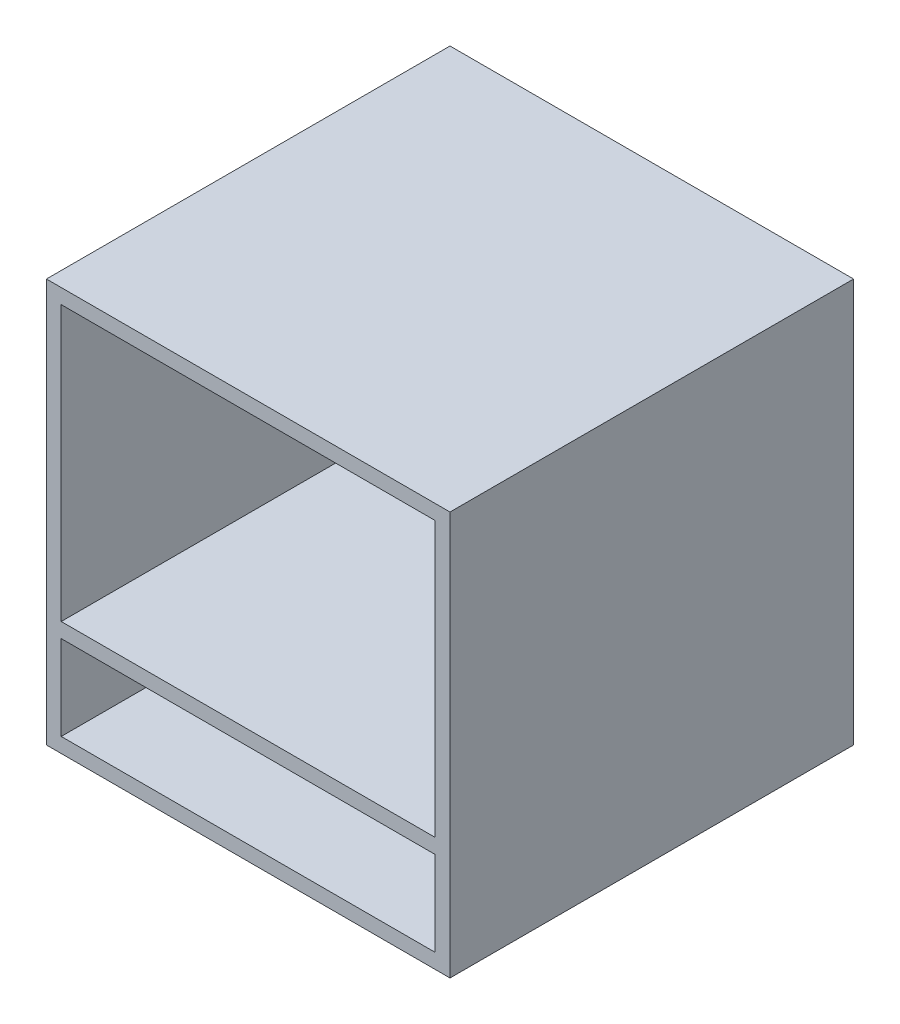
ISO-10303-21;
HEADER;
FILE_DESCRIPTION(('STEP AP214'),'2;1');
FILE_NAME('part.step','',(''),(''),'','','');
FILE_SCHEMA(('AUTOMOTIVE_DESIGN { 1 0 10303 214 1 1 1 1 }'));
ENDSEC;
DATA;
#1=APPLICATION_CONTEXT('core data for automotive mechanical design processes');
#2=APPLICATION_PROTOCOL_DEFINITION('international standard','automotive_design',2000,#1);
#3=PRODUCT_CONTEXT('',#1,'mechanical');
#4=PRODUCT('Part','Part','',(#3));
#5=PRODUCT_RELATED_PRODUCT_CATEGORY('part','',(#4));
#6=PRODUCT_DEFINITION_FORMATION('','',#4);
#7=PRODUCT_DEFINITION_CONTEXT('part definition',#1,'design');
#8=PRODUCT_DEFINITION('design','',#6,#7);
#9=PRODUCT_DEFINITION_SHAPE('','',#8);
#10=(LENGTH_UNIT() NAMED_UNIT(*) SI_UNIT(.MILLI.,.METRE.));
#11=(NAMED_UNIT(*) PLANE_ANGLE_UNIT() SI_UNIT($,.RADIAN.));
#12=(NAMED_UNIT(*) SI_UNIT($,.STERADIAN.) SOLID_ANGLE_UNIT());
#13=UNCERTAINTY_MEASURE_WITH_UNIT(LENGTH_MEASURE(1.E-05),#10,'distance_accuracy_value','');
#14=(GEOMETRIC_REPRESENTATION_CONTEXT(3) GLOBAL_UNCERTAINTY_ASSIGNED_CONTEXT((#13)) GLOBAL_UNIT_ASSIGNED_CONTEXT((#10,
#11,#12)) REPRESENTATION_CONTEXT('',''));
#15=CARTESIAN_POINT('',(0.,0.,0.));
#16=DIRECTION('',(0.,0.,1.));
#17=DIRECTION('',(1.,0.,0.));
#18=AXIS2_PLACEMENT_3D('',#15,#16,#17);
#19=CARTESIAN_POINT('',(139.,300.,-150.));
#20=DIRECTION('',(-1.,0.,0.));
#21=DIRECTION('',(0.,0.,1.));
#22=AXIS2_PLACEMENT_3D('',#19,#20,#21);
#23=PLANE('',#22);
#24=DIRECTION('',(0.,0.,1.));
#25=VECTOR('',#24,1.);
#26=CARTESIAN_POINT('',(139.,74.,-150.));
#27=LINE('',#26,#25);
#28=CARTESIAN_POINT('',(139.,74.,-139.));
#29=VERTEX_POINT('',#28);
#30=CARTESIAN_POINT('',(139.,74.,150.));
#31=VERTEX_POINT('',#30);
#32=EDGE_CURVE('E144',#29,#31,#27,.T.);
#33=ORIENTED_EDGE('',*,*,#32,.F.);
#34=DIRECTION('',(0.,-1.,0.));
#35=VECTOR('',#34,1.);
#36=CARTESIAN_POINT('',(139.,300.,-139.));
#37=LINE('',#36,#35);
#38=CARTESIAN_POINT('',(139.,11.,-139.));
#39=VERTEX_POINT('',#38);
#40=EDGE_CURVE('E164',#29,#39,#37,.T.);
#41=ORIENTED_EDGE('',*,*,#40,.T.);
#42=DIRECTION('',(0.,0.,-1.));
#43=VECTOR('',#42,1.);
#44=CARTESIAN_POINT('',(139.,11.,-150.));
#45=LINE('',#44,#43);
#46=CARTESIAN_POINT('',(139.,11.,150.));
#47=VERTEX_POINT('',#46);
#48=EDGE_CURVE('E157',#47,#39,#45,.T.);
#49=ORIENTED_EDGE('',*,*,#48,.F.);
#50=DIRECTION('',(0.,-1.,0.));
#51=VECTOR('',#50,1.);
#52=CARTESIAN_POINT('',(139.,300.,150.));
#53=LINE('',#52,#51);
#54=EDGE_CURVE('E49',#31,#47,#53,.T.);
#55=ORIENTED_EDGE('',*,*,#54,.F.);
#56=EDGE_LOOP('',(#33,#41,#49,#55));
#57=FACE_BOUND('',#56,.T.);
#58=ADVANCED_FACE('F34',(#57),#23,.T.);
#59=CARTESIAN_POINT('',(-150.,300.,-139.));
#60=DIRECTION('',(0.,0.,1.));
#61=DIRECTION('',(1.,0.,0.));
#62=AXIS2_PLACEMENT_3D('',#59,#60,#61);
#63=PLANE('',#62);
#64=DIRECTION('',(1.,0.,0.));
#65=VECTOR('',#64,1.);
#66=CARTESIAN_POINT('',(-150.,74.,-139.));
#67=LINE('',#66,#65);
#68=CARTESIAN_POINT('',(-139.,74.,-139.));
#69=VERTEX_POINT('',#68);
#70=EDGE_CURVE('E154',#69,#29,#67,.T.);
#71=ORIENTED_EDGE('',*,*,#70,.F.);
#72=DIRECTION('',(0.,-1.,0.));
#73=VECTOR('',#72,1.);
#74=CARTESIAN_POINT('',(-139.,300.,-139.));
#75=LINE('',#74,#73);
#76=CARTESIAN_POINT('',(-139.,11.,-139.));
#77=VERTEX_POINT('',#76);
#78=EDGE_CURVE('E140',#69,#77,#75,.T.);
#79=ORIENTED_EDGE('',*,*,#78,.T.);
#80=DIRECTION('',(-1.,0.,0.));
#81=VECTOR('',#80,1.);
#82=CARTESIAN_POINT('',(-150.,11.,-139.));
#83=LINE('',#82,#81);
#84=EDGE_CURVE('E160',#39,#77,#83,.T.);
#85=ORIENTED_EDGE('',*,*,#84,.F.);
#86=ORIENTED_EDGE('',*,*,#40,.F.);
#87=EDGE_LOOP('',(#71,#79,#85,#86));
#88=FACE_BOUND('',#87,.T.);
#89=ADVANCED_FACE('F238',(#88),#63,.T.);
#90=CARTESIAN_POINT('',(-139.,300.,-150.));
#91=DIRECTION('',(1.,0.,0.));
#92=DIRECTION('',(0.,0.,-1.));
#93=AXIS2_PLACEMENT_3D('',#90,#91,#92);
#94=PLANE('',#93);
#95=DIRECTION('',(0.,0.,-1.));
#96=VECTOR('',#95,1.);
#97=CARTESIAN_POINT('',(-139.,74.,-150.));
#98=LINE('',#97,#96);
#99=CARTESIAN_POINT('',(-139.,74.,150.));
#100=VERTEX_POINT('',#99);
#101=EDGE_CURVE('E11',#100,#69,#98,.T.);
#102=ORIENTED_EDGE('',*,*,#101,.F.);
#103=DIRECTION('',(0.,-1.,0.));
#104=VECTOR('',#103,1.);
#105=CARTESIAN_POINT('',(-139.,300.,150.));
#106=LINE('',#105,#104);
#107=CARTESIAN_POINT('',(-139.,11.,150.));
#108=VERTEX_POINT('',#107);
#109=EDGE_CURVE('E124',#100,#108,#106,.T.);
#110=ORIENTED_EDGE('',*,*,#109,.T.);
#111=DIRECTION('',(0.,0.,1.));
#112=VECTOR('',#111,1.);
#113=CARTESIAN_POINT('',(-139.,11.,-150.));
#114=LINE('',#113,#112);
#115=EDGE_CURVE('E171',#77,#108,#114,.T.);
#116=ORIENTED_EDGE('',*,*,#115,.F.);
#117=ORIENTED_EDGE('',*,*,#78,.F.);
#118=EDGE_LOOP('',(#102,#110,#116,#117));
#119=FACE_BOUND('',#118,.T.);
#120=ADVANCED_FACE('F139',(#119),#94,.T.);
#121=CARTESIAN_POINT('',(-150.,300.,150.));
#122=DIRECTION('',(0.,0.,-1.));
#123=DIRECTION('',(-1.,0.,0.));
#124=AXIS2_PLACEMENT_3D('',#121,#122,#123);
#125=PLANE('',#124);
#126=DIRECTION('',(1.,0.,0.));
#127=VECTOR('',#126,1.);
#128=CARTESIAN_POINT('',(-150.,74.,150.));
#129=LINE('',#128,#127);
#130=EDGE_CURVE('E129',#100,#31,#129,.T.);
#131=ORIENTED_EDGE('',*,*,#130,.T.);
#132=ORIENTED_EDGE('',*,*,#54,.T.);
#133=DIRECTION('',(1.,0.,0.));
#134=VECTOR('',#133,1.);
#135=CARTESIAN_POINT('',(-150.,11.,150.));
#136=LINE('',#135,#134);
#137=EDGE_CURVE('E131',#108,#47,#136,.T.);
#138=ORIENTED_EDGE('',*,*,#137,.F.);
#139=ORIENTED_EDGE('',*,*,#109,.F.);
#140=EDGE_LOOP('',(#131,#132,#138,#139));
#141=FACE_BOUND('',#140,.T.);
#142=DIRECTION('',(-1.,0.,0.));
#143=VECTOR('',#142,1.);
#144=CARTESIAN_POINT('',(-150.,85.,150.));
#145=LINE('',#144,#143);
#146=CARTESIAN_POINT('',(139.,85.,150.));
#147=VERTEX_POINT('',#146);
#148=CARTESIAN_POINT('',(-139.,85.,150.));
#149=VERTEX_POINT('',#148);
#150=EDGE_CURVE('E146',#147,#149,#145,.T.);
#151=ORIENTED_EDGE('',*,*,#150,.T.);
#152=CARTESIAN_POINT('',(-139.,289.,150.));
#153=VERTEX_POINT('',#152);
#154=EDGE_CURVE('E135',#153,#149,#106,.T.);
#155=ORIENTED_EDGE('',*,*,#154,.F.);
#156=DIRECTION('',(1.,0.,0.));
#157=VECTOR('',#156,1.);
#158=CARTESIAN_POINT('',(-150.,289.,150.));
#159=LINE('',#158,#157);
#160=CARTESIAN_POINT('',(139.,289.,150.));
#161=VERTEX_POINT('',#160);
#162=EDGE_CURVE('E180',#153,#161,#159,.T.);
#163=ORIENTED_EDGE('',*,*,#162,.T.);
#164=EDGE_CURVE('E136',#161,#147,#53,.T.);
#165=ORIENTED_EDGE('',*,*,#164,.T.);
#166=EDGE_LOOP('',(#151,#155,#163,#165));
#167=FACE_BOUND('',#166,.T.);
#168=DIRECTION('',(0.,-1.,0.));
#169=VECTOR('',#168,1.);
#170=CARTESIAN_POINT('',(-150.,300.,150.));
#171=LINE('',#170,#169);
#172=CARTESIAN_POINT('',(-150.,300.,150.));
#173=VERTEX_POINT('',#172);
#174=CARTESIAN_POINT('',(-150.,0.,150.));
#175=VERTEX_POINT('',#174);
#176=EDGE_CURVE('E207',#173,#175,#171,.T.);
#177=ORIENTED_EDGE('',*,*,#176,.T.);
#178=DIRECTION('',(1.,0.,0.));
#179=VECTOR('',#178,1.);
#180=CARTESIAN_POINT('',(-150.,0.,150.));
#181=LINE('',#180,#179);
#182=CARTESIAN_POINT('',(150.,0.,150.));
#183=VERTEX_POINT('',#182);
#184=EDGE_CURVE('E189',#175,#183,#181,.T.);
#185=ORIENTED_EDGE('',*,*,#184,.T.);
#186=DIRECTION('',(0.,-1.,0.));
#187=VECTOR('',#186,1.);
#188=CARTESIAN_POINT('',(150.,300.,150.));
#189=LINE('',#188,#187);
#190=CARTESIAN_POINT('',(150.,300.,150.));
#191=VERTEX_POINT('',#190);
#192=EDGE_CURVE('E195',#191,#183,#189,.T.);
#193=ORIENTED_EDGE('',*,*,#192,.F.);
#194=DIRECTION('',(1.,0.,0.));
#195=VECTOR('',#194,1.);
#196=CARTESIAN_POINT('',(-150.,300.,150.));
#197=LINE('',#196,#195);
#198=EDGE_CURVE('E193',#173,#191,#197,.T.);
#199=ORIENTED_EDGE('',*,*,#198,.F.);
#200=EDGE_LOOP('',(#177,#185,#193,#199));
#201=FACE_BOUND('',#200,.T.);
#202=ADVANCED_FACE('F126',(#141,#167,#201),#125,.F.);
#203=CARTESIAN_POINT('',(150.,300.,-150.));
#204=DIRECTION('',(-1.,0.,0.));
#205=DIRECTION('',(0.,0.,1.));
#206=AXIS2_PLACEMENT_3D('',#203,#204,#205);
#207=PLANE('',#206);
#208=ORIENTED_EDGE('',*,*,#192,.T.);
#209=DIRECTION('',(0.,0.,-1.));
#210=VECTOR('',#209,1.);
#211=CARTESIAN_POINT('',(150.,0.,-150.));
#212=LINE('',#211,#210);
#213=CARTESIAN_POINT('',(150.,0.,-150.));
#214=VERTEX_POINT('',#213);
#215=EDGE_CURVE('E163',#183,#214,#212,.T.);
#216=ORIENTED_EDGE('',*,*,#215,.T.);
#217=DIRECTION('',(0.,-1.,0.));
#218=VECTOR('',#217,1.);
#219=CARTESIAN_POINT('',(150.,300.,-150.));
#220=LINE('',#219,#218);
#221=CARTESIAN_POINT('',(150.,300.,-150.));
#222=VERTEX_POINT('',#221);
#223=EDGE_CURVE('E211',#222,#214,#220,.T.);
#224=ORIENTED_EDGE('',*,*,#223,.F.);
#225=DIRECTION('',(0.,0.,-1.));
#226=VECTOR('',#225,1.);
#227=CARTESIAN_POINT('',(150.,300.,-150.));
#228=LINE('',#227,#226);
#229=EDGE_CURVE('E185',#191,#222,#228,.T.);
#230=ORIENTED_EDGE('',*,*,#229,.F.);
#231=EDGE_LOOP('',(#208,#216,#224,#230));
#232=FACE_BOUND('',#231,.T.);
#233=ADVANCED_FACE('F36',(#232),#207,.F.);
#234=CARTESIAN_POINT('',(-150.,300.,-150.));
#235=DIRECTION('',(0.,0.,1.));
#236=DIRECTION('',(1.,0.,0.));
#237=AXIS2_PLACEMENT_3D('',#234,#235,#236);
#238=PLANE('',#237);
#239=ORIENTED_EDGE('',*,*,#223,.T.);
#240=DIRECTION('',(-1.,0.,0.));
#241=VECTOR('',#240,1.);
#242=CARTESIAN_POINT('',(-150.,0.,-150.));
#243=LINE('',#242,#241);
#244=CARTESIAN_POINT('',(-150.,0.,-150.));
#245=VERTEX_POINT('',#244);
#246=EDGE_CURVE('E198',#214,#245,#243,.T.);
#247=ORIENTED_EDGE('',*,*,#246,.T.);
#248=DIRECTION('',(0.,-1.,0.));
#249=VECTOR('',#248,1.);
#250=CARTESIAN_POINT('',(-150.,300.,-150.));
#251=LINE('',#250,#249);
#252=CARTESIAN_POINT('',(-150.,300.,-150.));
#253=VERTEX_POINT('',#252);
#254=EDGE_CURVE('E209',#253,#245,#251,.T.);
#255=ORIENTED_EDGE('',*,*,#254,.F.);
#256=DIRECTION('',(-1.,0.,0.));
#257=VECTOR('',#256,1.);
#258=CARTESIAN_POINT('',(-150.,300.,-150.));
#259=LINE('',#258,#257);
#260=EDGE_CURVE('E188',#222,#253,#259,.T.);
#261=ORIENTED_EDGE('',*,*,#260,.F.);
#262=EDGE_LOOP('',(#239,#247,#255,#261));
#263=FACE_BOUND('',#262,.T.);
#264=ADVANCED_FACE('F267',(#263),#238,.F.);
#265=CARTESIAN_POINT('',(-150.,300.,-150.));
#266=DIRECTION('',(1.,0.,0.));
#267=DIRECTION('',(0.,0.,-1.));
#268=AXIS2_PLACEMENT_3D('',#265,#266,#267);
#269=PLANE('',#268);
#270=ORIENTED_EDGE('',*,*,#254,.T.);
#271=DIRECTION('',(0.,0.,1.));
#272=VECTOR('',#271,1.);
#273=CARTESIAN_POINT('',(-150.,0.,-150.));
#274=LINE('',#273,#272);
#275=EDGE_CURVE('E201',#245,#175,#274,.T.);
#276=ORIENTED_EDGE('',*,*,#275,.T.);
#277=ORIENTED_EDGE('',*,*,#176,.F.);
#278=DIRECTION('',(0.,0.,1.));
#279=VECTOR('',#278,1.);
#280=CARTESIAN_POINT('',(-150.,300.,-150.));
#281=LINE('',#280,#279);
#282=EDGE_CURVE('E191',#253,#173,#281,.T.);
#283=ORIENTED_EDGE('',*,*,#282,.F.);
#284=EDGE_LOOP('',(#270,#276,#277,#283));
#285=FACE_BOUND('',#284,.T.);
#286=ADVANCED_FACE('F258',(#285),#269,.F.);
#287=CARTESIAN_POINT('',(0.,300.,0.));
#288=DIRECTION('',(0.,1.,0.));
#289=DIRECTION('',(0.,0.,1.));
#290=AXIS2_PLACEMENT_3D('',#287,#288,#289);
#291=PLANE('',#290);
#292=ORIENTED_EDGE('',*,*,#229,.T.);
#293=ORIENTED_EDGE('',*,*,#260,.T.);
#294=ORIENTED_EDGE('',*,*,#282,.T.);
#295=ORIENTED_EDGE('',*,*,#198,.T.);
#296=EDGE_LOOP('',(#292,#293,#294,#295));
#297=FACE_BOUND('',#296,.T.);
#298=ADVANCED_FACE('F252',(#297),#291,.T.);
#299=CARTESIAN_POINT('',(0.,0.,0.));
#300=DIRECTION('',(0.,1.,0.));
#301=DIRECTION('',(0.,0.,1.));
#302=AXIS2_PLACEMENT_3D('',#299,#300,#301);
#303=PLANE('',#302);
#304=ORIENTED_EDGE('',*,*,#215,.F.);
#305=ORIENTED_EDGE('',*,*,#184,.F.);
#306=ORIENTED_EDGE('',*,*,#275,.F.);
#307=ORIENTED_EDGE('',*,*,#246,.F.);
#308=EDGE_LOOP('',(#304,#305,#306,#307));
#309=FACE_BOUND('',#308,.T.);
#310=ADVANCED_FACE('F248',(#309),#303,.F.);
#311=DIRECTION('',(0.,0.,-1.));
#312=VECTOR('',#311,1.);
#313=CARTESIAN_POINT('',(139.,85.,-150.));
#314=LINE('',#313,#312);
#315=CARTESIAN_POINT('',(139.,85.,-139.));
#316=VERTEX_POINT('',#315);
#317=EDGE_CURVE('E57',#147,#316,#314,.T.);
#318=ORIENTED_EDGE('',*,*,#317,.F.);
#319=ORIENTED_EDGE('',*,*,#164,.F.);
#320=DIRECTION('',(0.,0.,-1.));
#321=VECTOR('',#320,1.);
#322=CARTESIAN_POINT('',(139.,289.,-150.));
#323=LINE('',#322,#321);
#324=CARTESIAN_POINT('',(139.,289.,-139.));
#325=VERTEX_POINT('',#324);
#326=EDGE_CURVE('E165',#161,#325,#323,.T.);
#327=ORIENTED_EDGE('',*,*,#326,.T.);
#328=EDGE_CURVE('E161',#325,#316,#37,.T.);
#329=ORIENTED_EDGE('',*,*,#328,.T.);
#330=EDGE_LOOP('',(#318,#319,#327,#329));
#331=FACE_BOUND('',#330,.T.);
#332=ADVANCED_FACE('F221',(#331),#23,.T.);
#333=DIRECTION('',(-1.,0.,0.));
#334=VECTOR('',#333,1.);
#335=CARTESIAN_POINT('',(-150.,85.,-139.));
#336=LINE('',#335,#334);
#337=CARTESIAN_POINT('',(-139.,85.,-139.));
#338=VERTEX_POINT('',#337);
#339=EDGE_CURVE('E145',#316,#338,#336,.T.);
#340=ORIENTED_EDGE('',*,*,#339,.F.);
#341=ORIENTED_EDGE('',*,*,#328,.F.);
#342=DIRECTION('',(-1.,0.,0.));
#343=VECTOR('',#342,1.);
#344=CARTESIAN_POINT('',(-150.,289.,-139.));
#345=LINE('',#344,#343);
#346=CARTESIAN_POINT('',(-139.,289.,-139.));
#347=VERTEX_POINT('',#346);
#348=EDGE_CURVE('E168',#325,#347,#345,.T.);
#349=ORIENTED_EDGE('',*,*,#348,.T.);
#350=EDGE_CURVE('E172',#347,#338,#75,.T.);
#351=ORIENTED_EDGE('',*,*,#350,.T.);
#352=EDGE_LOOP('',(#340,#341,#349,#351));
#353=FACE_BOUND('',#352,.T.);
#354=ADVANCED_FACE('F227',(#353),#63,.T.);
#355=DIRECTION('',(0.,0.,1.));
#356=VECTOR('',#355,1.);
#357=CARTESIAN_POINT('',(-139.,85.,-150.));
#358=LINE('',#357,#356);
#359=EDGE_CURVE('E42',#338,#149,#358,.T.);
#360=ORIENTED_EDGE('',*,*,#359,.F.);
#361=ORIENTED_EDGE('',*,*,#350,.F.);
#362=DIRECTION('',(0.,0.,1.));
#363=VECTOR('',#362,1.);
#364=CARTESIAN_POINT('',(-139.,289.,-150.));
#365=LINE('',#364,#363);
#366=EDGE_CURVE('E176',#347,#153,#365,.T.);
#367=ORIENTED_EDGE('',*,*,#366,.T.);
#368=ORIENTED_EDGE('',*,*,#154,.T.);
#369=EDGE_LOOP('',(#360,#361,#367,#368));
#370=FACE_BOUND('',#369,.T.);
#371=ADVANCED_FACE('F228',(#370),#94,.T.);
#372=CARTESIAN_POINT('',(0.,289.,0.));
#373=DIRECTION('',(0.,1.,0.));
#374=DIRECTION('',(0.,0.,1.));
#375=AXIS2_PLACEMENT_3D('',#372,#373,#374);
#376=PLANE('',#375);
#377=ORIENTED_EDGE('',*,*,#326,.F.);
#378=ORIENTED_EDGE('',*,*,#162,.F.);
#379=ORIENTED_EDGE('',*,*,#366,.F.);
#380=ORIENTED_EDGE('',*,*,#348,.F.);
#381=EDGE_LOOP('',(#377,#378,#379,#380));
#382=FACE_BOUND('',#381,.T.);
#383=ADVANCED_FACE('F224',(#382),#376,.F.);
#384=CARTESIAN_POINT('',(0.,11.,0.));
#385=DIRECTION('',(0.,1.,0.));
#386=DIRECTION('',(0.,0.,1.));
#387=AXIS2_PLACEMENT_3D('',#384,#385,#386);
#388=PLANE('',#387);
#389=ORIENTED_EDGE('',*,*,#48,.T.);
#390=ORIENTED_EDGE('',*,*,#84,.T.);
#391=ORIENTED_EDGE('',*,*,#115,.T.);
#392=ORIENTED_EDGE('',*,*,#137,.T.);
#393=EDGE_LOOP('',(#389,#390,#391,#392));
#394=FACE_BOUND('',#393,.T.);
#395=ADVANCED_FACE('F235',(#394),#388,.T.);
#396=CARTESIAN_POINT('',(-150.,74.,-150.));
#397=DIRECTION('',(0.,-1.,0.));
#398=DIRECTION('',(0.,0.,-1.));
#399=AXIS2_PLACEMENT_3D('',#396,#397,#398);
#400=PLANE('',#399);
#401=ORIENTED_EDGE('',*,*,#70,.T.);
#402=ORIENTED_EDGE('',*,*,#32,.T.);
#403=ORIENTED_EDGE('',*,*,#130,.F.);
#404=ORIENTED_EDGE('',*,*,#101,.T.);
#405=EDGE_LOOP('',(#401,#402,#403,#404));
#406=FACE_BOUND('',#405,.T.);
#407=ADVANCED_FACE('F143',(#406),#400,.T.);
#408=CARTESIAN_POINT('',(-150.,85.,-150.));
#409=DIRECTION('',(0.,1.,0.));
#410=DIRECTION('',(-1.,0.,0.));
#411=AXIS2_PLACEMENT_3D('',#408,#409,#410);
#412=PLANE('',#411);
#413=ORIENTED_EDGE('',*,*,#150,.F.);
#414=ORIENTED_EDGE('',*,*,#317,.T.);
#415=ORIENTED_EDGE('',*,*,#339,.T.);
#416=ORIENTED_EDGE('',*,*,#359,.T.);
#417=EDGE_LOOP('',(#413,#414,#415,#416));
#418=FACE_BOUND('',#417,.T.);
#419=ADVANCED_FACE('F215',(#418),#412,.T.);
#420=CLOSED_SHELL('',(#58,#89,#120,#202,#233,#264,#286,#298,#310,#332,#354,#371,#383,#395,#407,#419));
#421=MANIFOLD_SOLID_BREP('B2',#420);
#422=ADVANCED_BREP_SHAPE_REPRESENTATION('',(#18,#421),#14);
#423=SHAPE_DEFINITION_REPRESENTATION(#9,#422);
ENDSEC;
END-ISO-10303-21;
